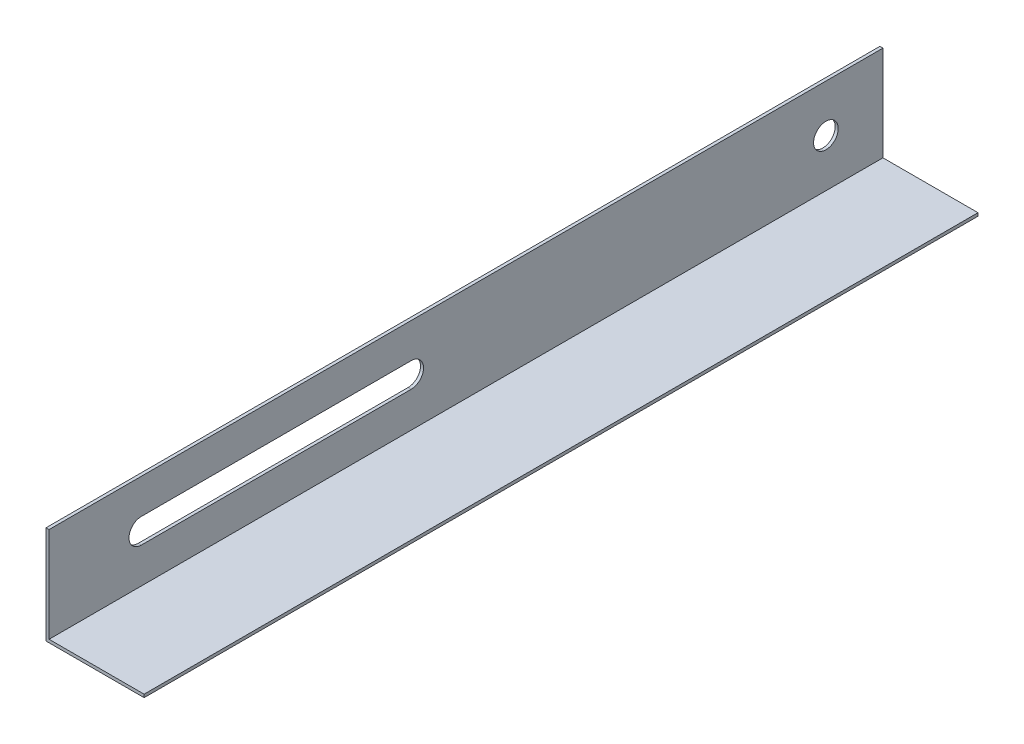
ISO-10303-21;
HEADER;
FILE_DESCRIPTION(('STEP AP214'),'2;1');
FILE_NAME('part.step','',(''),(''),'','','');
FILE_SCHEMA(('AUTOMOTIVE_DESIGN { 1 0 10303 214 1 1 1 1 }'));
ENDSEC;
DATA;
#1=APPLICATION_CONTEXT('core data for automotive mechanical design processes');
#2=APPLICATION_PROTOCOL_DEFINITION('international standard','automotive_design',2000,#1);
#3=PRODUCT_CONTEXT('',#1,'mechanical');
#4=PRODUCT('Part','Part','',(#3));
#5=PRODUCT_RELATED_PRODUCT_CATEGORY('part','',(#4));
#6=PRODUCT_DEFINITION_FORMATION('','',#4);
#7=PRODUCT_DEFINITION_CONTEXT('part definition',#1,'design');
#8=PRODUCT_DEFINITION('design','',#6,#7);
#9=PRODUCT_DEFINITION_SHAPE('','',#8);
#10=(LENGTH_UNIT() NAMED_UNIT(*) SI_UNIT(.MILLI.,.METRE.));
#11=(NAMED_UNIT(*) PLANE_ANGLE_UNIT() SI_UNIT($,.RADIAN.));
#12=(NAMED_UNIT(*) SI_UNIT($,.STERADIAN.) SOLID_ANGLE_UNIT());
#13=UNCERTAINTY_MEASURE_WITH_UNIT(LENGTH_MEASURE(1.E-05),#10,'distance_accuracy_value','');
#14=(GEOMETRIC_REPRESENTATION_CONTEXT(3) GLOBAL_UNCERTAINTY_ASSIGNED_CONTEXT((#13)) GLOBAL_UNIT_ASSIGNED_CONTEXT((#10,
#11,#12)) REPRESENTATION_CONTEXT('',''));
#15=CARTESIAN_POINT('',(0.,0.,0.));
#16=DIRECTION('',(0.,0.,1.));
#17=DIRECTION('',(1.,0.,0.));
#18=AXIS2_PLACEMENT_3D('',#15,#16,#17);
#19=CARTESIAN_POINT('',(49.2125,0.,431.8));
#20=DIRECTION('',(0.,-1.,0.));
#21=DIRECTION('',(1.,0.,0.));
#22=AXIS2_PLACEMENT_3D('',#19,#20,#21);
#23=PLANE('',#22);
#24=DIRECTION('',(-1.,0.,0.));
#25=VECTOR('',#24,1.);
#26=CARTESIAN_POINT('',(49.2125,0.,0.));
#27=LINE('',#26,#25);
#28=CARTESIAN_POINT('',(49.2125,0.,0.));
#29=VERTEX_POINT('',#28);
#30=CARTESIAN_POINT('',(0.,0.,0.));
#31=VERTEX_POINT('',#30);
#32=EDGE_CURVE('E136',#29,#31,#27,.T.);
#33=ORIENTED_EDGE('',*,*,#32,.T.);
#34=DIRECTION('',(0.,0.,-1.));
#35=VECTOR('',#34,1.);
#36=CARTESIAN_POINT('',(0.,0.,431.8));
#37=LINE('',#36,#35);
#38=CARTESIAN_POINT('',(0.,0.,431.8));
#39=VERTEX_POINT('',#38);
#40=EDGE_CURVE('E179',#39,#31,#37,.T.);
#41=ORIENTED_EDGE('',*,*,#40,.F.);
#42=DIRECTION('',(-1.,0.,0.));
#43=VECTOR('',#42,1.);
#44=CARTESIAN_POINT('',(49.2125,0.,431.8));
#45=LINE('',#44,#43);
#46=CARTESIAN_POINT('',(49.2125,0.,431.8));
#47=VERTEX_POINT('',#46);
#48=EDGE_CURVE('E139',#47,#39,#45,.T.);
#49=ORIENTED_EDGE('',*,*,#48,.F.);
#50=DIRECTION('',(0.,0.,-1.));
#51=VECTOR('',#50,1.);
#52=CARTESIAN_POINT('',(49.2125,0.,431.8));
#53=LINE('',#52,#51);
#54=EDGE_CURVE('E153',#47,#29,#53,.T.);
#55=ORIENTED_EDGE('',*,*,#54,.T.);
#56=EDGE_LOOP('',(#33,#41,#49,#55));
#57=FACE_BOUND('',#56,.T.);
#58=ADVANCED_FACE('F33',(#57),#23,.F.);
#59=CARTESIAN_POINT('',(0.,0.,431.8));
#60=DIRECTION('',(-1.,0.,0.));
#61=DIRECTION('',(0.,-1.,0.));
#62=AXIS2_PLACEMENT_3D('',#59,#60,#61);
#63=PLANE('',#62);
#64=CARTESIAN_POINT('',(0.,24.7735948291677,29.5387922851518));
#65=DIRECTION('',(1.,0.,0.));
#66=DIRECTION('',(0.,1.,0.));
#67=AXIS2_PLACEMENT_3D('',#64,#65,#66);
#68=CIRCLE('',#67,6.3881);
#69=CARTESIAN_POINT('',(0.,31.1616948291677,29.5387922851518));
#70=VERTEX_POINT('',#69);
#71=EDGE_CURVE('E312',#70,#70,#68,.T.);
#72=ORIENTED_EDGE('',*,*,#71,.F.);
#73=EDGE_LOOP('',(#72));
#74=FACE_BOUND('',#73,.T.);
#75=DIRECTION('',(0.,0.,-1.));
#76=VECTOR('',#75,1.);
#77=CARTESIAN_POINT('',(0.,18.3600948291677,384.0054804));
#78=LINE('',#77,#76);
#79=CARTESIAN_POINT('',(0.,18.3600948291677,384.0054804));
#80=VERTEX_POINT('',#79);
#81=CARTESIAN_POINT('',(0.,18.3600948291677,244.3054804));
#82=VERTEX_POINT('',#81);
#83=EDGE_CURVE('E122',#80,#82,#78,.T.);
#84=ORIENTED_EDGE('',*,*,#83,.F.);
#85=CARTESIAN_POINT('',(0.,24.7735948291677,384.0054804));
#86=DIRECTION('',(1.,0.,0.));
#87=DIRECTION('',(0.,1.,0.));
#88=AXIS2_PLACEMENT_3D('',#85,#86,#87);
#89=CIRCLE('',#88,6.4135);
#90=CARTESIAN_POINT('',(0.,31.1870948291677,384.0054804));
#91=VERTEX_POINT('',#90);
#92=EDGE_CURVE('E48',#91,#80,#89,.T.);
#93=ORIENTED_EDGE('',*,*,#92,.F.);
#94=DIRECTION('',(0.,0.,1.));
#95=VECTOR('',#94,1.);
#96=CARTESIAN_POINT('',(0.,31.1870948291677,384.0054804));
#97=LINE('',#96,#95);
#98=CARTESIAN_POINT('',(0.,31.1870948291677,244.3054804));
#99=VERTEX_POINT('',#98);
#100=EDGE_CURVE('E129',#99,#91,#97,.T.);
#101=ORIENTED_EDGE('',*,*,#100,.F.);
#102=CARTESIAN_POINT('',(0.,24.7735948291677,244.3054804));
#103=DIRECTION('',(1.,0.,0.));
#104=DIRECTION('',(0.,1.,0.));
#105=AXIS2_PLACEMENT_3D('',#102,#103,#104);
#106=CIRCLE('',#105,6.4135);
#107=EDGE_CURVE('E113',#82,#99,#106,.T.);
#108=ORIENTED_EDGE('',*,*,#107,.F.);
#109=EDGE_LOOP('',(#84,#93,#101,#108));
#110=FACE_BOUND('',#109,.T.);
#111=DIRECTION('',(0.,1.,0.));
#112=VECTOR('',#111,1.);
#113=CARTESIAN_POINT('',(0.,0.,0.));
#114=LINE('',#113,#112);
#115=CARTESIAN_POINT('',(0.,49.2125,0.));
#116=VERTEX_POINT('',#115);
#117=EDGE_CURVE('E156',#31,#116,#114,.T.);
#118=ORIENTED_EDGE('',*,*,#117,.T.);
#119=DIRECTION('',(0.,0.,-1.));
#120=VECTOR('',#119,1.);
#121=CARTESIAN_POINT('',(0.,49.2125,431.8));
#122=LINE('',#121,#120);
#123=CARTESIAN_POINT('',(0.,49.2125,431.8));
#124=VERTEX_POINT('',#123);
#125=EDGE_CURVE('E176',#124,#116,#122,.T.);
#126=ORIENTED_EDGE('',*,*,#125,.F.);
#127=DIRECTION('',(0.,1.,0.));
#128=VECTOR('',#127,1.);
#129=CARTESIAN_POINT('',(0.,0.,431.8));
#130=LINE('',#129,#128);
#131=EDGE_CURVE('E142',#39,#124,#130,.T.);
#132=ORIENTED_EDGE('',*,*,#131,.F.);
#133=ORIENTED_EDGE('',*,*,#40,.T.);
#134=EDGE_LOOP('',(#118,#126,#132,#133));
#135=FACE_BOUND('',#134,.T.);
#136=ADVANCED_FACE('F126',(#74,#110,#135),#63,.F.);
#137=CARTESIAN_POINT('',(0.,49.2125,431.8));
#138=DIRECTION('',(0.,-1.,0.));
#139=DIRECTION('',(1.,0.,0.));
#140=AXIS2_PLACEMENT_3D('',#137,#138,#139);
#141=PLANE('',#140);
#142=DIRECTION('',(-1.,0.,0.));
#143=VECTOR('',#142,1.);
#144=CARTESIAN_POINT('',(0.,49.2125,0.));
#145=LINE('',#144,#143);
#146=CARTESIAN_POINT('',(-1.5875,49.2125,0.));
#147=VERTEX_POINT('',#146);
#148=EDGE_CURVE('E158',#116,#147,#145,.T.);
#149=ORIENTED_EDGE('',*,*,#148,.T.);
#150=DIRECTION('',(0.,0.,-1.));
#151=VECTOR('',#150,1.);
#152=CARTESIAN_POINT('',(-1.5875,49.2125,431.8));
#153=LINE('',#152,#151);
#154=CARTESIAN_POINT('',(-1.5875,49.2125,431.8));
#155=VERTEX_POINT('',#154);
#156=EDGE_CURVE('E173',#155,#147,#153,.T.);
#157=ORIENTED_EDGE('',*,*,#156,.F.);
#158=DIRECTION('',(-1.,0.,0.));
#159=VECTOR('',#158,1.);
#160=CARTESIAN_POINT('',(0.,49.2125,431.8));
#161=LINE('',#160,#159);
#162=EDGE_CURVE('E145',#124,#155,#161,.T.);
#163=ORIENTED_EDGE('',*,*,#162,.F.);
#164=ORIENTED_EDGE('',*,*,#125,.T.);
#165=EDGE_LOOP('',(#149,#157,#163,#164));
#166=FACE_BOUND('',#165,.T.);
#167=ADVANCED_FACE('F211',(#166),#141,.F.);
#168=CARTESIAN_POINT('',(-1.5875,49.2125,431.8));
#169=DIRECTION('',(1.,0.,0.));
#170=DIRECTION('',(0.,1.,0.));
#171=AXIS2_PLACEMENT_3D('',#168,#169,#170);
#172=PLANE('',#171);
#173=CARTESIAN_POINT('',(-1.58749999999999,24.7735948291677,29.5387922851518));
#174=DIRECTION('',(1.,0.,0.));
#175=DIRECTION('',(0.,1.,0.));
#176=AXIS2_PLACEMENT_3D('',#173,#174,#175);
#177=CIRCLE('',#176,6.3881);
#178=CARTESIAN_POINT('',(-1.58749999999999,31.1616948291677,29.5387922851518));
#179=VERTEX_POINT('',#178);
#180=EDGE_CURVE('E36',#179,#179,#177,.T.);
#181=ORIENTED_EDGE('',*,*,#180,.T.);
#182=EDGE_LOOP('',(#181));
#183=FACE_BOUND('',#182,.T.);
#184=DIRECTION('',(0.,0.,1.));
#185=VECTOR('',#184,1.);
#186=CARTESIAN_POINT('',(-1.5875,31.1870948291677,431.8));
#187=LINE('',#186,#185);
#188=CARTESIAN_POINT('',(-1.58749999999999,31.1870948291677,244.3054804));
#189=VERTEX_POINT('',#188);
#190=CARTESIAN_POINT('',(-1.58749999999999,31.1870948291677,384.0054804));
#191=VERTEX_POINT('',#190);
#192=EDGE_CURVE('E41',#189,#191,#187,.T.);
#193=ORIENTED_EDGE('',*,*,#192,.T.);
#194=CARTESIAN_POINT('',(-1.58749999999999,24.7735948291677,384.0054804));
#195=DIRECTION('',(1.,0.,0.));
#196=DIRECTION('',(0.,1.,0.));
#197=AXIS2_PLACEMENT_3D('',#194,#195,#196);
#198=CIRCLE('',#197,6.4135);
#199=CARTESIAN_POINT('',(-1.58749999999999,18.3600948291677,384.0054804));
#200=VERTEX_POINT('',#199);
#201=EDGE_CURVE('E11',#191,#200,#198,.T.);
#202=ORIENTED_EDGE('',*,*,#201,.T.);
#203=DIRECTION('',(0.,0.,-1.));
#204=VECTOR('',#203,1.);
#205=CARTESIAN_POINT('',(-1.5875,18.3600948291677,431.8));
#206=LINE('',#205,#204);
#207=CARTESIAN_POINT('',(-1.5875,18.3600948291677,244.3054804));
#208=VERTEX_POINT('',#207);
#209=EDGE_CURVE('E182',#200,#208,#206,.T.);
#210=ORIENTED_EDGE('',*,*,#209,.T.);
#211=CARTESIAN_POINT('',(-1.58749999999999,24.7735948291677,244.3054804));
#212=DIRECTION('',(1.,0.,0.));
#213=DIRECTION('',(0.,1.,0.));
#214=AXIS2_PLACEMENT_3D('',#211,#212,#213);
#215=CIRCLE('',#214,6.4135);
#216=EDGE_CURVE('E116',#208,#189,#215,.T.);
#217=ORIENTED_EDGE('',*,*,#216,.T.);
#218=EDGE_LOOP('',(#193,#202,#210,#217));
#219=FACE_BOUND('',#218,.T.);
#220=DIRECTION('',(0.,-1.,0.));
#221=VECTOR('',#220,1.);
#222=CARTESIAN_POINT('',(-1.5875,49.2125,0.));
#223=LINE('',#222,#221);
#224=CARTESIAN_POINT('',(-1.58750000000001,-1.5875,0.));
#225=VERTEX_POINT('',#224);
#226=EDGE_CURVE('E160',#147,#225,#223,.T.);
#227=ORIENTED_EDGE('',*,*,#226,.T.);
#228=DIRECTION('',(0.,0.,-1.));
#229=VECTOR('',#228,1.);
#230=CARTESIAN_POINT('',(-1.58750000000001,-1.5875,431.8));
#231=LINE('',#230,#229);
#232=CARTESIAN_POINT('',(-1.58750000000001,-1.5875,431.8));
#233=VERTEX_POINT('',#232);
#234=EDGE_CURVE('E170',#233,#225,#231,.T.);
#235=ORIENTED_EDGE('',*,*,#234,.F.);
#236=DIRECTION('',(0.,-1.,0.));
#237=VECTOR('',#236,1.);
#238=CARTESIAN_POINT('',(-1.5875,49.2125,431.8));
#239=LINE('',#238,#237);
#240=EDGE_CURVE('E147',#155,#233,#239,.T.);
#241=ORIENTED_EDGE('',*,*,#240,.F.);
#242=ORIENTED_EDGE('',*,*,#156,.T.);
#243=EDGE_LOOP('',(#227,#235,#241,#242));
#244=FACE_BOUND('',#243,.T.);
#245=ADVANCED_FACE('F187',(#183,#219,#244),#172,.F.);
#246=CARTESIAN_POINT('',(-1.58750000000001,-1.5875,431.8));
#247=DIRECTION('',(0.,1.,0.));
#248=DIRECTION('',(-1.,0.,0.));
#249=AXIS2_PLACEMENT_3D('',#246,#247,#248);
#250=PLANE('',#249);
#251=DIRECTION('',(1.,0.,0.));
#252=VECTOR('',#251,1.);
#253=CARTESIAN_POINT('',(-1.58750000000001,-1.5875,0.));
#254=LINE('',#253,#252);
#255=CARTESIAN_POINT('',(49.2125,-1.58749999999999,0.));
#256=VERTEX_POINT('',#255);
#257=EDGE_CURVE('E162',#225,#256,#254,.T.);
#258=ORIENTED_EDGE('',*,*,#257,.T.);
#259=DIRECTION('',(0.,0.,-1.));
#260=VECTOR('',#259,1.);
#261=CARTESIAN_POINT('',(49.2125,-1.58749999999999,431.8));
#262=LINE('',#261,#260);
#263=CARTESIAN_POINT('',(49.2125,-1.58749999999999,431.8));
#264=VERTEX_POINT('',#263);
#265=EDGE_CURVE('E167',#264,#256,#262,.T.);
#266=ORIENTED_EDGE('',*,*,#265,.F.);
#267=DIRECTION('',(1.,0.,0.));
#268=VECTOR('',#267,1.);
#269=CARTESIAN_POINT('',(-1.58750000000001,-1.5875,431.8));
#270=LINE('',#269,#268);
#271=EDGE_CURVE('E149',#233,#264,#270,.T.);
#272=ORIENTED_EDGE('',*,*,#271,.F.);
#273=ORIENTED_EDGE('',*,*,#234,.T.);
#274=EDGE_LOOP('',(#258,#266,#272,#273));
#275=FACE_BOUND('',#274,.T.);
#276=ADVANCED_FACE('F230',(#275),#250,.F.);
#277=CARTESIAN_POINT('',(49.2125,-1.58749999999999,431.8));
#278=DIRECTION('',(-1.,0.,0.));
#279=DIRECTION('',(0.,-1.,0.));
#280=AXIS2_PLACEMENT_3D('',#277,#278,#279);
#281=PLANE('',#280);
#282=DIRECTION('',(0.,1.,0.));
#283=VECTOR('',#282,1.);
#284=CARTESIAN_POINT('',(49.2125,-1.58749999999999,0.));
#285=LINE('',#284,#283);
#286=EDGE_CURVE('E143',#256,#29,#285,.T.);
#287=ORIENTED_EDGE('',*,*,#286,.T.);
#288=ORIENTED_EDGE('',*,*,#54,.F.);
#289=DIRECTION('',(0.,1.,0.));
#290=VECTOR('',#289,1.);
#291=CARTESIAN_POINT('',(49.2125,-1.58749999999999,431.8));
#292=LINE('',#291,#290);
#293=EDGE_CURVE('E151',#264,#47,#292,.T.);
#294=ORIENTED_EDGE('',*,*,#293,.F.);
#295=ORIENTED_EDGE('',*,*,#265,.T.);
#296=EDGE_LOOP('',(#287,#288,#294,#295));
#297=FACE_BOUND('',#296,.T.);
#298=ADVANCED_FACE('F228',(#297),#281,.F.);
#299=CARTESIAN_POINT('',(0.,0.,431.8));
#300=DIRECTION('',(0.,0.,-1.));
#301=DIRECTION('',(-1.,0.,0.));
#302=AXIS2_PLACEMENT_3D('',#299,#300,#301);
#303=PLANE('',#302);
#304=ORIENTED_EDGE('',*,*,#48,.T.);
#305=ORIENTED_EDGE('',*,*,#131,.T.);
#306=ORIENTED_EDGE('',*,*,#162,.T.);
#307=ORIENTED_EDGE('',*,*,#240,.T.);
#308=ORIENTED_EDGE('',*,*,#271,.T.);
#309=ORIENTED_EDGE('',*,*,#293,.T.);
#310=EDGE_LOOP('',(#304,#305,#306,#307,#308,#309));
#311=FACE_BOUND('',#310,.T.);
#312=ADVANCED_FACE('F201',(#311),#303,.F.);
#313=CARTESIAN_POINT('',(0.,0.,0.));
#314=DIRECTION('',(0.,0.,-1.));
#315=DIRECTION('',(-1.,0.,0.));
#316=AXIS2_PLACEMENT_3D('',#313,#314,#315);
#317=PLANE('',#316);
#318=ORIENTED_EDGE('',*,*,#32,.F.);
#319=ORIENTED_EDGE('',*,*,#286,.F.);
#320=ORIENTED_EDGE('',*,*,#257,.F.);
#321=ORIENTED_EDGE('',*,*,#226,.F.);
#322=ORIENTED_EDGE('',*,*,#148,.F.);
#323=ORIENTED_EDGE('',*,*,#117,.F.);
#324=EDGE_LOOP('',(#318,#319,#320,#321,#322,#323));
#325=FACE_BOUND('',#324,.T.);
#326=ADVANCED_FACE('F194',(#325),#317,.T.);
#327=CARTESIAN_POINT('',(-127.,24.7735948291677,384.0054804));
#328=DIRECTION('',(1.,0.,0.));
#329=DIRECTION('',(0.,1.,0.));
#330=AXIS2_PLACEMENT_3D('',#327,#328,#329);
#331=CYLINDRICAL_SURFACE('',#330,6.4135);
#332=DIRECTION('',(1.,0.,0.));
#333=VECTOR('',#332,1.);
#334=CARTESIAN_POINT('',(-127.,31.1870948291677,384.0054804));
#335=LINE('',#334,#333);
#336=EDGE_CURVE('E134',#191,#91,#335,.T.);
#337=ORIENTED_EDGE('',*,*,#336,.T.);
#338=ORIENTED_EDGE('',*,*,#92,.T.);
#339=DIRECTION('',(1.,0.,0.));
#340=VECTOR('',#339,1.);
#341=CARTESIAN_POINT('',(-127.,18.3600948291677,384.0054804));
#342=LINE('',#341,#340);
#343=EDGE_CURVE('E119',#200,#80,#342,.T.);
#344=ORIENTED_EDGE('',*,*,#343,.F.);
#345=ORIENTED_EDGE('',*,*,#201,.F.);
#346=EDGE_LOOP('',(#337,#338,#344,#345));
#347=FACE_BOUND('',#346,.T.);
#348=ADVANCED_FACE('F192',(#347),#331,.F.);
#349=CARTESIAN_POINT('',(-127.,31.1870948291677,384.0054804));
#350=DIRECTION('',(0.,1.,0.));
#351=DIRECTION('',(-1.,0.,0.));
#352=AXIS2_PLACEMENT_3D('',#349,#350,#351);
#353=PLANE('',#352);
#354=DIRECTION('',(1.,0.,0.));
#355=VECTOR('',#354,1.);
#356=CARTESIAN_POINT('',(-127.,31.1870948291677,244.3054804));
#357=LINE('',#356,#355);
#358=EDGE_CURVE('E118',#189,#99,#357,.T.);
#359=ORIENTED_EDGE('',*,*,#358,.T.);
#360=ORIENTED_EDGE('',*,*,#100,.T.);
#361=ORIENTED_EDGE('',*,*,#336,.F.);
#362=ORIENTED_EDGE('',*,*,#192,.F.);
#363=EDGE_LOOP('',(#359,#360,#361,#362));
#364=FACE_BOUND('',#363,.T.);
#365=ADVANCED_FACE('F191',(#364),#353,.F.);
#366=CARTESIAN_POINT('',(-127.,24.7735948291677,244.3054804));
#367=DIRECTION('',(1.,0.,0.));
#368=DIRECTION('',(0.,1.,0.));
#369=AXIS2_PLACEMENT_3D('',#366,#367,#368);
#370=CYLINDRICAL_SURFACE('',#369,6.4135);
#371=DIRECTION('',(1.,0.,0.));
#372=VECTOR('',#371,1.);
#373=CARTESIAN_POINT('',(-127.,18.3600948291677,244.3054804));
#374=LINE('',#373,#372);
#375=EDGE_CURVE('E56',#208,#82,#374,.T.);
#376=ORIENTED_EDGE('',*,*,#375,.T.);
#377=ORIENTED_EDGE('',*,*,#107,.T.);
#378=ORIENTED_EDGE('',*,*,#358,.F.);
#379=ORIENTED_EDGE('',*,*,#216,.F.);
#380=EDGE_LOOP('',(#376,#377,#378,#379));
#381=FACE_BOUND('',#380,.T.);
#382=ADVANCED_FACE('F110',(#381),#370,.F.);
#383=CARTESIAN_POINT('',(-127.,18.3600948291677,384.0054804));
#384=DIRECTION('',(0.,-1.,0.));
#385=DIRECTION('',(1.,0.,0.));
#386=AXIS2_PLACEMENT_3D('',#383,#384,#385);
#387=PLANE('',#386);
#388=ORIENTED_EDGE('',*,*,#343,.T.);
#389=ORIENTED_EDGE('',*,*,#83,.T.);
#390=ORIENTED_EDGE('',*,*,#375,.F.);
#391=ORIENTED_EDGE('',*,*,#209,.F.);
#392=EDGE_LOOP('',(#388,#389,#390,#391));
#393=FACE_BOUND('',#392,.T.);
#394=ADVANCED_FACE('F123',(#393),#387,.F.);
#395=CARTESIAN_POINT('',(-127.,24.7735948291677,29.5387922851518));
#396=DIRECTION('',(1.,0.,0.));
#397=DIRECTION('',(0.,1.,0.));
#398=AXIS2_PLACEMENT_3D('',#395,#396,#397);
#399=CYLINDRICAL_SURFACE('',#398,6.3881);
#400=ORIENTED_EDGE('',*,*,#71,.T.);
#401=EDGE_LOOP('',(#400));
#402=FACE_BOUND('',#401,.T.);
#403=ORIENTED_EDGE('',*,*,#180,.F.);
#404=EDGE_LOOP('',(#403));
#405=FACE_BOUND('',#404,.T.);
#406=ADVANCED_FACE('F282',(#402,#405),#399,.F.);
#407=CLOSED_SHELL('',(#58,#136,#167,#245,#276,#298,#312,#326,#348,#365,#382,#394,#406));
#408=MANIFOLD_SOLID_BREP('B2',#407);
#409=ADVANCED_BREP_SHAPE_REPRESENTATION('',(#18,#408),#14);
#410=SHAPE_DEFINITION_REPRESENTATION(#9,#409);
ENDSEC;
END-ISO-10303-21;
